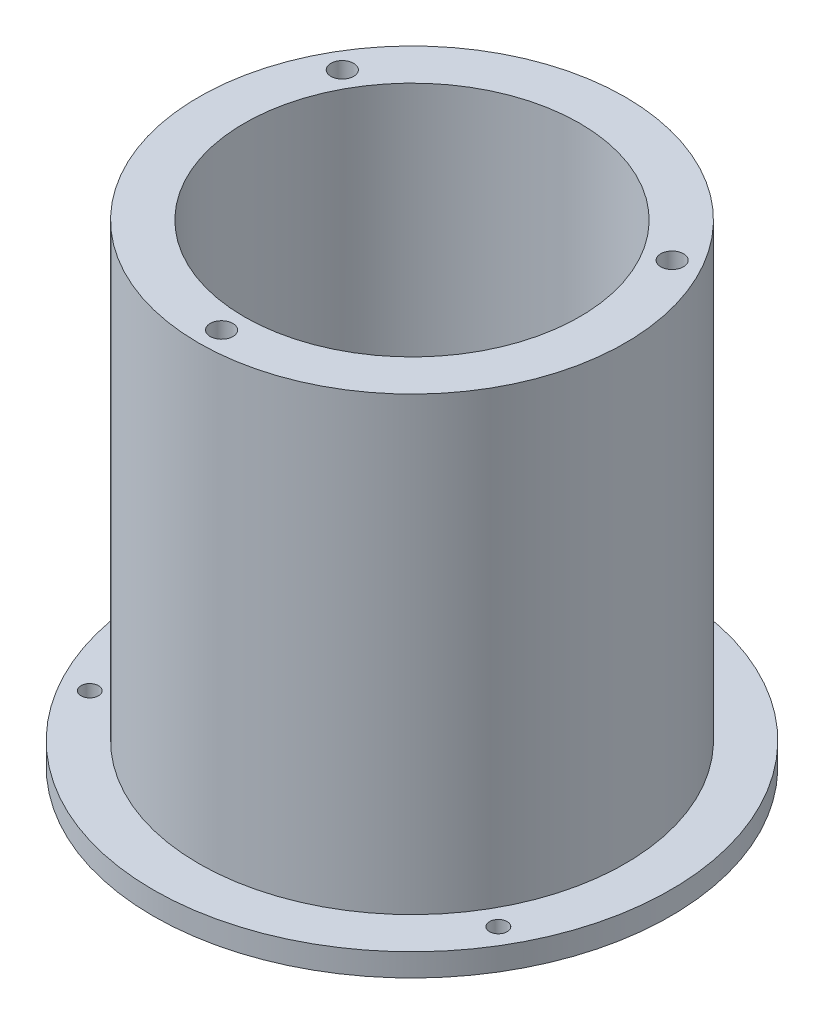
ISO-10303-21;
HEADER;
FILE_DESCRIPTION(('STEP AP214'),'2;1');
FILE_NAME('part.step','',(''),(''),'','','');
FILE_SCHEMA(('AUTOMOTIVE_DESIGN { 1 0 10303 214 1 1 1 1 }'));
ENDSEC;
DATA;
#1=APPLICATION_CONTEXT('core data for automotive mechanical design processes');
#2=APPLICATION_PROTOCOL_DEFINITION('international standard','automotive_design',2000,#1);
#3=PRODUCT_CONTEXT('',#1,'mechanical');
#4=PRODUCT('Part','Part','',(#3));
#5=PRODUCT_RELATED_PRODUCT_CATEGORY('part','',(#4));
#6=PRODUCT_DEFINITION_FORMATION('','',#4);
#7=PRODUCT_DEFINITION_CONTEXT('part definition',#1,'design');
#8=PRODUCT_DEFINITION('design','',#6,#7);
#9=PRODUCT_DEFINITION_SHAPE('','',#8);
#10=(LENGTH_UNIT() NAMED_UNIT(*) SI_UNIT(.MILLI.,.METRE.));
#11=(NAMED_UNIT(*) PLANE_ANGLE_UNIT() SI_UNIT($,.RADIAN.));
#12=(NAMED_UNIT(*) SI_UNIT($,.STERADIAN.) SOLID_ANGLE_UNIT());
#13=UNCERTAINTY_MEASURE_WITH_UNIT(LENGTH_MEASURE(1.E-05),#10,'distance_accuracy_value','');
#14=(GEOMETRIC_REPRESENTATION_CONTEXT(3) GLOBAL_UNCERTAINTY_ASSIGNED_CONTEXT((#13)) GLOBAL_UNIT_ASSIGNED_CONTEXT((#10,
#11,#12)) REPRESENTATION_CONTEXT('',''));
#15=CARTESIAN_POINT('',(0.,0.,0.));
#16=DIRECTION('',(0.,0.,1.));
#17=DIRECTION('',(1.,0.,0.));
#18=AXIS2_PLACEMENT_3D('',#15,#16,#17);
#19=CARTESIAN_POINT('',(0.,4.,0.));
#20=DIRECTION('',(0.,-1.,0.));
#21=DIRECTION('',(0.,0.,-1.));
#22=AXIS2_PLACEMENT_3D('',#19,#20,#21);
#23=CYLINDRICAL_SURFACE('',#22,29.5);
#24=CARTESIAN_POINT('',(0.,83.3,0.));
#25=DIRECTION('',(0.,1.,0.));
#26=DIRECTION('',(0.,0.,1.));
#27=AXIS2_PLACEMENT_3D('',#24,#25,#26);
#28=CIRCLE('',#27,29.5);
#29=CARTESIAN_POINT('',(0.,83.3,29.5));
#30=VERTEX_POINT('',#29);
#31=EDGE_CURVE('E62',#30,#30,#28,.T.);
#32=ORIENTED_EDGE('',*,*,#31,.T.);
#33=EDGE_LOOP('',(#32));
#34=FACE_BOUND('',#33,.T.);
#35=CARTESIAN_POINT('',(0.,6.,0.));
#36=DIRECTION('',(0.,-1.,0.));
#37=DIRECTION('',(0.,0.,-1.));
#38=AXIS2_PLACEMENT_3D('',#35,#36,#37);
#39=CIRCLE('',#38,29.5);
#40=CARTESIAN_POINT('',(0.,6.,-29.5));
#41=VERTEX_POINT('',#40);
#42=EDGE_CURVE('E41',#41,#41,#39,.T.);
#43=ORIENTED_EDGE('',*,*,#42,.T.);
#44=EDGE_LOOP('',(#43));
#45=FACE_BOUND('',#44,.T.);
#46=ADVANCED_FACE('F37',(#34,#45),#23,.F.);
#47=CARTESIAN_POINT('',(0.,4.,0.));
#48=DIRECTION('',(0.,1.,0.));
#49=DIRECTION('',(0.,0.,1.));
#50=AXIS2_PLACEMENT_3D('',#47,#48,#49);
#51=PLANE('',#50);
#52=CARTESIAN_POINT('',(-35.9400542570541,4.,20.7500000000002));
#53=DIRECTION('',(0.,1.,0.));
#54=DIRECTION('',(0.866025403784436,0.,-0.500000000000004));
#55=AXIS2_PLACEMENT_3D('',#52,#53,#54);
#56=CIRCLE('',#55,1.55);
#57=CARTESIAN_POINT('',(-34.5977148811882,4.,19.9750000000002));
#58=VERTEX_POINT('',#57);
#59=EDGE_CURVE('E68',#58,#58,#56,.T.);
#60=ORIENTED_EDGE('',*,*,#59,.F.);
#61=EDGE_LOOP('',(#60));
#62=FACE_BOUND('',#61,.T.);
#63=CARTESIAN_POINT('',(35.9400542570544,4.,20.7499999999997));
#64=DIRECTION('',(0.,1.,0.));
#65=DIRECTION('',(-0.866025403784443,0.,-0.499999999999992));
#66=AXIS2_PLACEMENT_3D('',#63,#64,#65);
#67=CIRCLE('',#66,1.55);
#68=CARTESIAN_POINT('',(34.5977148811885,4.,19.9749999999997));
#69=VERTEX_POINT('',#68);
#70=EDGE_CURVE('E80',#69,#69,#67,.T.);
#71=ORIENTED_EDGE('',*,*,#70,.F.);
#72=EDGE_LOOP('',(#71));
#73=FACE_BOUND('',#72,.T.);
#74=CARTESIAN_POINT('',(0.,4.,-41.5));
#75=DIRECTION('',(0.,1.,0.));
#76=DIRECTION('',(0.,0.,1.));
#77=AXIS2_PLACEMENT_3D('',#74,#75,#76);
#78=CIRCLE('',#77,1.55);
#79=CARTESIAN_POINT('',(0.,4.,-39.95));
#80=VERTEX_POINT('',#79);
#81=EDGE_CURVE('E63',#80,#80,#78,.T.);
#82=ORIENTED_EDGE('',*,*,#81,.F.);
#83=EDGE_LOOP('',(#82));
#84=FACE_BOUND('',#83,.T.);
#85=CARTESIAN_POINT('',(0.,4.,0.));
#86=DIRECTION('',(0.,1.,0.));
#87=DIRECTION('',(0.,0.,1.));
#88=AXIS2_PLACEMENT_3D('',#85,#86,#87);
#89=CIRCLE('',#88,45.5);
#90=CARTESIAN_POINT('',(0.,4.,45.5));
#91=VERTEX_POINT('',#90);
#92=EDGE_CURVE('E10',#91,#91,#89,.T.);
#93=ORIENTED_EDGE('',*,*,#92,.T.);
#94=EDGE_LOOP('',(#93));
#95=FACE_BOUND('',#94,.T.);
#96=CARTESIAN_POINT('',(0.,4.,0.));
#97=DIRECTION('',(0.,1.,0.));
#98=DIRECTION('',(0.,0.,1.));
#99=AXIS2_PLACEMENT_3D('',#96,#97,#98);
#100=CIRCLE('',#99,37.5);
#101=CARTESIAN_POINT('',(0.,4.,37.5));
#102=VERTEX_POINT('',#101);
#103=EDGE_CURVE('E55',#102,#102,#100,.T.);
#104=ORIENTED_EDGE('',*,*,#103,.F.);
#105=EDGE_LOOP('',(#104));
#106=FACE_BOUND('',#105,.T.);
#107=ADVANCED_FACE('F94',(#62,#73,#84,#95,#106),#51,.T.);
#108=CARTESIAN_POINT('',(0.,0.,0.));
#109=DIRECTION('',(0.,1.,0.));
#110=DIRECTION('',(0.,0.,1.));
#111=AXIS2_PLACEMENT_3D('',#108,#109,#110);
#112=PLANE('',#111);
#113=CARTESIAN_POINT('',(0.,0.,0.));
#114=DIRECTION('',(0.,-1.,0.));
#115=DIRECTION('',(0.,0.,-1.));
#116=AXIS2_PLACEMENT_3D('',#113,#114,#115);
#117=CIRCLE('',#116,30.5);
#118=CARTESIAN_POINT('',(0.,0.,-30.5));
#119=VERTEX_POINT('',#118);
#120=EDGE_CURVE('E167',#119,#119,#117,.T.);
#121=ORIENTED_EDGE('',*,*,#120,.F.);
#122=EDGE_LOOP('',(#121));
#123=FACE_BOUND('',#122,.T.);
#124=CARTESIAN_POINT('',(-35.9400542570541,0.,20.7500000000002));
#125=DIRECTION('',(0.,1.,0.));
#126=DIRECTION('',(0.,0.,1.));
#127=AXIS2_PLACEMENT_3D('',#124,#125,#126);
#128=CIRCLE('',#127,1.55);
#129=CARTESIAN_POINT('',(-35.9400542570541,0.,22.3000000000002));
#130=VERTEX_POINT('',#129);
#131=EDGE_CURVE('E67',#130,#130,#128,.T.);
#132=ORIENTED_EDGE('',*,*,#131,.T.);
#133=EDGE_LOOP('',(#132));
#134=FACE_BOUND('',#133,.T.);
#135=CARTESIAN_POINT('',(35.9400542570544,0.,20.7499999999997));
#136=DIRECTION('',(0.,1.,0.));
#137=DIRECTION('',(0.,0.,1.));
#138=AXIS2_PLACEMENT_3D('',#135,#136,#137);
#139=CIRCLE('',#138,1.55);
#140=CARTESIAN_POINT('',(35.9400542570544,0.,22.2999999999997));
#141=VERTEX_POINT('',#140);
#142=EDGE_CURVE('E64',#141,#141,#139,.T.);
#143=ORIENTED_EDGE('',*,*,#142,.T.);
#144=EDGE_LOOP('',(#143));
#145=FACE_BOUND('',#144,.T.);
#146=CARTESIAN_POINT('',(0.,0.,-41.5));
#147=DIRECTION('',(0.,1.,0.));
#148=DIRECTION('',(0.,0.,1.));
#149=AXIS2_PLACEMENT_3D('',#146,#147,#148);
#150=CIRCLE('',#149,1.55);
#151=CARTESIAN_POINT('',(0.,0.,-39.95));
#152=VERTEX_POINT('',#151);
#153=EDGE_CURVE('E58',#152,#152,#150,.T.);
#154=ORIENTED_EDGE('',*,*,#153,.T.);
#155=EDGE_LOOP('',(#154));
#156=FACE_BOUND('',#155,.T.);
#157=CARTESIAN_POINT('',(0.,0.,0.));
#158=DIRECTION('',(0.,1.,0.));
#159=DIRECTION('',(0.,0.,1.));
#160=AXIS2_PLACEMENT_3D('',#157,#158,#159);
#161=CIRCLE('',#160,45.5);
#162=CARTESIAN_POINT('',(0.,0.,45.5));
#163=VERTEX_POINT('',#162);
#164=EDGE_CURVE('E46',#163,#163,#161,.T.);
#165=ORIENTED_EDGE('',*,*,#164,.F.);
#166=EDGE_LOOP('',(#165));
#167=FACE_BOUND('',#166,.T.);
#168=ADVANCED_FACE('F96',(#123,#134,#145,#156,#167),#112,.F.);
#169=CARTESIAN_POINT('',(0.,4.,0.));
#170=DIRECTION('',(0.,-1.,0.));
#171=DIRECTION('',(0.,0.,-1.));
#172=AXIS2_PLACEMENT_3D('',#169,#170,#171);
#173=CYLINDRICAL_SURFACE('',#172,45.5);
#174=ORIENTED_EDGE('',*,*,#92,.F.);
#175=EDGE_LOOP('',(#174));
#176=FACE_BOUND('',#175,.T.);
#177=ORIENTED_EDGE('',*,*,#164,.T.);
#178=EDGE_LOOP('',(#177));
#179=FACE_BOUND('',#178,.T.);
#180=ADVANCED_FACE('F39',(#176,#179),#173,.T.);
#181=CARTESIAN_POINT('',(0.,83.3,0.));
#182=DIRECTION('',(0.,1.,0.));
#183=DIRECTION('',(0.,0.,1.));
#184=AXIS2_PLACEMENT_3D('',#181,#182,#183);
#185=PLANE('',#184);
#186=CARTESIAN_POINT('',(2.42861286636753E-13,83.3,33.5));
#187=DIRECTION('',(0.,1.,0.));
#188=DIRECTION('',(0.866025403784436,0.,-0.500000000000004));
#189=AXIS2_PLACEMENT_3D('',#186,#187,#188);
#190=CIRCLE('',#189,2.);
#191=CARTESIAN_POINT('',(1.73205080756911,83.3,32.5));
#192=VERTEX_POINT('',#191);
#193=EDGE_CURVE('E180',#192,#192,#190,.T.);
#194=ORIENTED_EDGE('',*,*,#193,.F.);
#195=EDGE_LOOP('',(#194));
#196=FACE_BOUND('',#195,.T.);
#197=CARTESIAN_POINT('',(29.0118510267785,83.3,-16.7500000000003));
#198=DIRECTION('',(0.,1.,0.));
#199=DIRECTION('',(-0.866025403784443,0.,-0.499999999999992));
#200=AXIS2_PLACEMENT_3D('',#197,#198,#199);
#201=CIRCLE('',#200,2.);
#202=CARTESIAN_POINT('',(27.2798002192096,83.3,-17.7500000000003));
#203=VERTEX_POINT('',#202);
#204=EDGE_CURVE('E171',#203,#203,#201,.T.);
#205=ORIENTED_EDGE('',*,*,#204,.F.);
#206=EDGE_LOOP('',(#205));
#207=FACE_BOUND('',#206,.T.);
#208=CARTESIAN_POINT('',(-29.0118510267787,83.3,-16.7499999999999));
#209=DIRECTION('',(0.,1.,0.));
#210=DIRECTION('',(0.,0.,1.));
#211=AXIS2_PLACEMENT_3D('',#208,#209,#210);
#212=CIRCLE('',#211,2.);
#213=CARTESIAN_POINT('',(-29.0118510267787,83.3,-14.7499999999999));
#214=VERTEX_POINT('',#213);
#215=EDGE_CURVE('E179',#214,#214,#212,.T.);
#216=ORIENTED_EDGE('',*,*,#215,.F.);
#217=EDGE_LOOP('',(#216));
#218=FACE_BOUND('',#217,.T.);
#219=CARTESIAN_POINT('',(0.,83.3,0.));
#220=DIRECTION('',(0.,1.,0.));
#221=DIRECTION('',(0.,0.,1.));
#222=AXIS2_PLACEMENT_3D('',#219,#220,#221);
#223=CIRCLE('',#222,37.5);
#224=CARTESIAN_POINT('',(0.,83.3,37.5));
#225=VERTEX_POINT('',#224);
#226=EDGE_CURVE('E52',#225,#225,#223,.T.);
#227=ORIENTED_EDGE('',*,*,#226,.T.);
#228=EDGE_LOOP('',(#227));
#229=FACE_BOUND('',#228,.T.);
#230=ORIENTED_EDGE('',*,*,#31,.F.);
#231=EDGE_LOOP('',(#230));
#232=FACE_BOUND('',#231,.T.);
#233=ADVANCED_FACE('F112',(#196,#207,#218,#229,#232),#185,.T.);
#234=CARTESIAN_POINT('',(0.,83.3,0.));
#235=DIRECTION('',(0.,-1.,0.));
#236=DIRECTION('',(0.,0.,-1.));
#237=AXIS2_PLACEMENT_3D('',#234,#235,#236);
#238=CYLINDRICAL_SURFACE('',#237,37.5);
#239=ORIENTED_EDGE('',*,*,#226,.F.);
#240=EDGE_LOOP('',(#239));
#241=FACE_BOUND('',#240,.T.);
#242=ORIENTED_EDGE('',*,*,#103,.T.);
#243=EDGE_LOOP('',(#242));
#244=FACE_BOUND('',#243,.T.);
#245=ADVANCED_FACE('F92',(#241,#244),#238,.T.);
#246=CARTESIAN_POINT('',(0.,-79.3,-41.5));
#247=DIRECTION('',(0.,1.,0.));
#248=DIRECTION('',(0.,0.,1.));
#249=AXIS2_PLACEMENT_3D('',#246,#247,#248);
#250=CYLINDRICAL_SURFACE('',#249,1.55);
#251=ORIENTED_EDGE('',*,*,#81,.T.);
#252=EDGE_LOOP('',(#251));
#253=FACE_BOUND('',#252,.T.);
#254=ORIENTED_EDGE('',*,*,#153,.F.);
#255=EDGE_LOOP('',(#254));
#256=FACE_BOUND('',#255,.T.);
#257=ADVANCED_FACE('F111',(#253,#256),#250,.F.);
#258=CARTESIAN_POINT('',(35.9400542570544,-79.3,20.7499999999997));
#259=DIRECTION('',(0.,1.,0.));
#260=DIRECTION('',(0.,0.,1.));
#261=AXIS2_PLACEMENT_3D('',#258,#259,#260);
#262=CYLINDRICAL_SURFACE('',#261,1.55);
#263=ORIENTED_EDGE('',*,*,#70,.T.);
#264=EDGE_LOOP('',(#263));
#265=FACE_BOUND('',#264,.T.);
#266=ORIENTED_EDGE('',*,*,#142,.F.);
#267=EDGE_LOOP('',(#266));
#268=FACE_BOUND('',#267,.T.);
#269=ADVANCED_FACE('F119',(#265,#268),#262,.F.);
#270=CARTESIAN_POINT('',(-35.9400542570541,-79.3,20.7500000000002));
#271=DIRECTION('',(0.,1.,0.));
#272=DIRECTION('',(0.,0.,1.));
#273=AXIS2_PLACEMENT_3D('',#270,#271,#272);
#274=CYLINDRICAL_SURFACE('',#273,1.55);
#275=ORIENTED_EDGE('',*,*,#59,.T.);
#276=EDGE_LOOP('',(#275));
#277=FACE_BOUND('',#276,.T.);
#278=ORIENTED_EDGE('',*,*,#131,.F.);
#279=EDGE_LOOP('',(#278));
#280=FACE_BOUND('',#279,.T.);
#281=ADVANCED_FACE('F122',(#277,#280),#274,.F.);
#282=CARTESIAN_POINT('',(-29.0118510267787,77.3,-16.7499999999999));
#283=DIRECTION('',(0.,1.,0.));
#284=DIRECTION('',(0.,0.,1.));
#285=AXIS2_PLACEMENT_3D('',#282,#283,#284);
#286=CYLINDRICAL_SURFACE('',#285,2.);
#287=CARTESIAN_POINT('',(-29.0118510267787,77.3,-16.7499999999999));
#288=DIRECTION('',(0.,1.,0.));
#289=DIRECTION('',(0.,0.,1.));
#290=AXIS2_PLACEMENT_3D('',#287,#288,#289);
#291=CIRCLE('',#290,2.);
#292=CARTESIAN_POINT('',(-29.0118510267787,77.3,-14.7499999999999));
#293=VERTEX_POINT('',#292);
#294=EDGE_CURVE('E191',#293,#293,#291,.T.);
#295=ORIENTED_EDGE('',*,*,#294,.F.);
#296=EDGE_LOOP('',(#295));
#297=FACE_BOUND('',#296,.T.);
#298=ORIENTED_EDGE('',*,*,#215,.T.);
#299=EDGE_LOOP('',(#298));
#300=FACE_BOUND('',#299,.T.);
#301=ADVANCED_FACE('F126',(#297,#300),#286,.F.);
#302=CARTESIAN_POINT('',(-29.0118510267787,77.3,-16.7499999999999));
#303=DIRECTION('',(0.,1.,0.));
#304=DIRECTION('',(0.,0.,1.));
#305=AXIS2_PLACEMENT_3D('',#302,#303,#304);
#306=PLANE('',#305);
#307=ORIENTED_EDGE('',*,*,#294,.T.);
#308=EDGE_LOOP('',(#307));
#309=FACE_BOUND('',#308,.T.);
#310=ADVANCED_FACE('F130',(#309),#306,.T.);
#311=CARTESIAN_POINT('',(29.0118510267785,77.3,-16.7500000000003));
#312=DIRECTION('',(0.,1.,0.));
#313=DIRECTION('',(0.,0.,1.));
#314=AXIS2_PLACEMENT_3D('',#311,#312,#313);
#315=CYLINDRICAL_SURFACE('',#314,2.);
#316=CARTESIAN_POINT('',(29.0118510267785,77.3,-16.7500000000003));
#317=DIRECTION('',(0.,1.,0.));
#318=DIRECTION('',(-0.866025403784443,0.,-0.499999999999992));
#319=AXIS2_PLACEMENT_3D('',#316,#317,#318);
#320=CIRCLE('',#319,2.);
#321=CARTESIAN_POINT('',(27.2798002192096,77.3,-17.7500000000003));
#322=VERTEX_POINT('',#321);
#323=EDGE_CURVE('E184',#322,#322,#320,.T.);
#324=ORIENTED_EDGE('',*,*,#323,.F.);
#325=EDGE_LOOP('',(#324));
#326=FACE_BOUND('',#325,.T.);
#327=ORIENTED_EDGE('',*,*,#204,.T.);
#328=EDGE_LOOP('',(#327));
#329=FACE_BOUND('',#328,.T.);
#330=ADVANCED_FACE('F134',(#326,#329),#315,.F.);
#331=CARTESIAN_POINT('',(29.0118510267785,77.3,-16.7500000000003));
#332=DIRECTION('',(0.,1.,0.));
#333=DIRECTION('',(-0.866025403784443,0.,-0.499999999999992));
#334=AXIS2_PLACEMENT_3D('',#331,#332,#333);
#335=PLANE('',#334);
#336=ORIENTED_EDGE('',*,*,#323,.T.);
#337=EDGE_LOOP('',(#336));
#338=FACE_BOUND('',#337,.T.);
#339=ADVANCED_FACE('F138',(#338),#335,.T.);
#340=CARTESIAN_POINT('',(2.42861286636753E-13,77.3,33.5));
#341=DIRECTION('',(0.,1.,0.));
#342=DIRECTION('',(0.,0.,1.));
#343=AXIS2_PLACEMENT_3D('',#340,#341,#342);
#344=CYLINDRICAL_SURFACE('',#343,2.);
#345=CARTESIAN_POINT('',(2.42861286636753E-13,77.3,33.5));
#346=DIRECTION('',(0.,1.,0.));
#347=DIRECTION('',(0.866025403784436,0.,-0.500000000000004));
#348=AXIS2_PLACEMENT_3D('',#345,#346,#347);
#349=CIRCLE('',#348,2.);
#350=CARTESIAN_POINT('',(1.73205080756911,77.3,32.5));
#351=VERTEX_POINT('',#350);
#352=EDGE_CURVE('E175',#351,#351,#349,.T.);
#353=ORIENTED_EDGE('',*,*,#352,.F.);
#354=EDGE_LOOP('',(#353));
#355=FACE_BOUND('',#354,.T.);
#356=ORIENTED_EDGE('',*,*,#193,.T.);
#357=EDGE_LOOP('',(#356));
#358=FACE_BOUND('',#357,.T.);
#359=ADVANCED_FACE('F142',(#355,#358),#344,.F.);
#360=CARTESIAN_POINT('',(2.42861286636753E-13,77.3,33.5));
#361=DIRECTION('',(0.,1.,0.));
#362=DIRECTION('',(0.866025403784436,0.,-0.500000000000004));
#363=AXIS2_PLACEMENT_3D('',#360,#361,#362);
#364=PLANE('',#363);
#365=ORIENTED_EDGE('',*,*,#352,.T.);
#366=EDGE_LOOP('',(#365));
#367=FACE_BOUND('',#366,.T.);
#368=ADVANCED_FACE('F146',(#367),#364,.T.);
#369=CARTESIAN_POINT('',(0.,6.,0.));
#370=DIRECTION('',(0.,-1.,0.));
#371=DIRECTION('',(0.,0.,-1.));
#372=AXIS2_PLACEMENT_3D('',#369,#370,#371);
#373=CYLINDRICAL_SURFACE('',#372,30.5);
#374=CARTESIAN_POINT('',(0.,6.,0.));
#375=DIRECTION('',(0.,-1.,0.));
#376=DIRECTION('',(0.,0.,-1.));
#377=AXIS2_PLACEMENT_3D('',#374,#375,#376);
#378=CIRCLE('',#377,30.5);
#379=CARTESIAN_POINT('',(0.,6.,-30.5));
#380=VERTEX_POINT('',#379);
#381=EDGE_CURVE('E165',#380,#380,#378,.T.);
#382=ORIENTED_EDGE('',*,*,#381,.F.);
#383=EDGE_LOOP('',(#382));
#384=FACE_BOUND('',#383,.T.);
#385=ORIENTED_EDGE('',*,*,#120,.T.);
#386=EDGE_LOOP('',(#385));
#387=FACE_BOUND('',#386,.T.);
#388=ADVANCED_FACE('F150',(#384,#387),#373,.F.);
#389=CARTESIAN_POINT('',(0.,6.,0.));
#390=DIRECTION('',(0.,-1.,0.));
#391=DIRECTION('',(0.,0.,-1.));
#392=AXIS2_PLACEMENT_3D('',#389,#390,#391);
#393=PLANE('',#392);
#394=ORIENTED_EDGE('',*,*,#42,.F.);
#395=EDGE_LOOP('',(#394));
#396=FACE_BOUND('',#395,.T.);
#397=ORIENTED_EDGE('',*,*,#381,.T.);
#398=EDGE_LOOP('',(#397));
#399=FACE_BOUND('',#398,.T.);
#400=ADVANCED_FACE('F154',(#396,#399),#393,.T.);
#401=CLOSED_SHELL('',(#46,#107,#168,#180,#233,#245,#257,#269,#281,#301,#310,#330,#339,#359,#368,
#388,#400));
#402=MANIFOLD_SOLID_BREP('B2',#401);
#403=ADVANCED_BREP_SHAPE_REPRESENTATION('',(#18,#402),#14);
#404=SHAPE_DEFINITION_REPRESENTATION(#9,#403);
ENDSEC;
END-ISO-10303-21;
